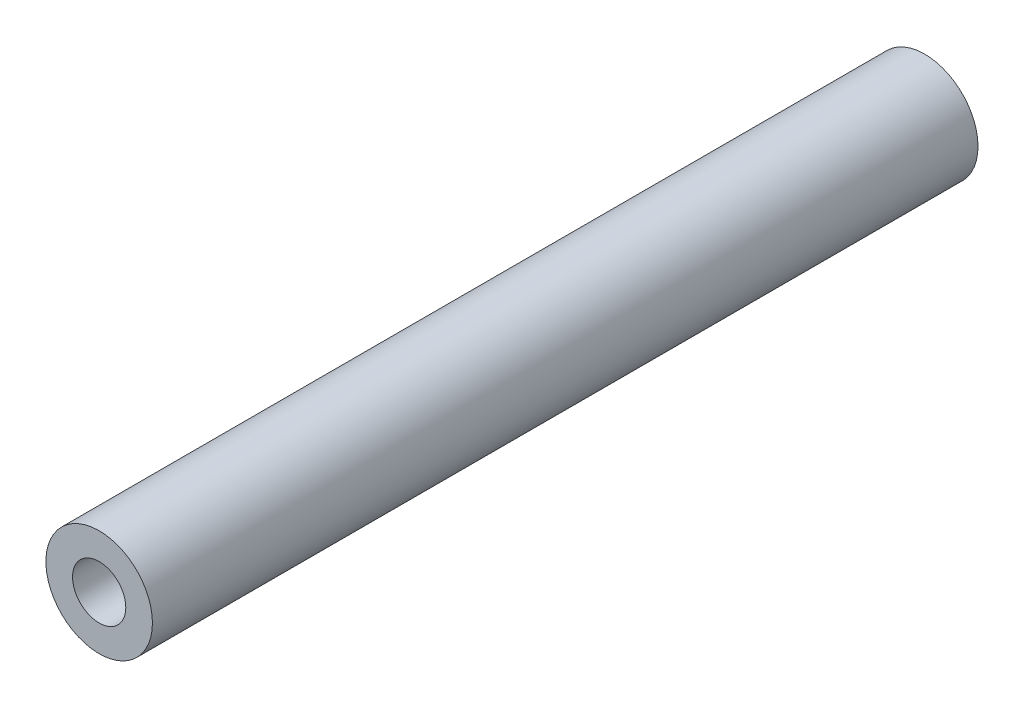
ISO-10303-21;
HEADER;
FILE_DESCRIPTION(('STEP AP214'),'2;1');
FILE_NAME('part.step','',(''),(''),'','','');
FILE_SCHEMA(('AUTOMOTIVE_DESIGN { 1 0 10303 214 1 1 1 1 }'));
ENDSEC;
DATA;
#1=APPLICATION_CONTEXT('core data for automotive mechanical design processes');
#2=APPLICATION_PROTOCOL_DEFINITION('international standard','automotive_design',2000,#1);
#3=PRODUCT_CONTEXT('',#1,'mechanical');
#4=PRODUCT('Part','Part','',(#3));
#5=PRODUCT_RELATED_PRODUCT_CATEGORY('part','',(#4));
#6=PRODUCT_DEFINITION_FORMATION('','',#4);
#7=PRODUCT_DEFINITION_CONTEXT('part definition',#1,'design');
#8=PRODUCT_DEFINITION('design','',#6,#7);
#9=PRODUCT_DEFINITION_SHAPE('','',#8);
#10=(LENGTH_UNIT() NAMED_UNIT(*) SI_UNIT(.MILLI.,.METRE.));
#11=(NAMED_UNIT(*) PLANE_ANGLE_UNIT() SI_UNIT($,.RADIAN.));
#12=(NAMED_UNIT(*) SI_UNIT($,.STERADIAN.) SOLID_ANGLE_UNIT());
#13=UNCERTAINTY_MEASURE_WITH_UNIT(LENGTH_MEASURE(1.E-05),#10,'distance_accuracy_value','');
#14=(GEOMETRIC_REPRESENTATION_CONTEXT(3) GLOBAL_UNCERTAINTY_ASSIGNED_CONTEXT((#13)) GLOBAL_UNIT_ASSIGNED_CONTEXT((#10,
#11,#12)) REPRESENTATION_CONTEXT('',''));
#15=CARTESIAN_POINT('',(0.,0.,0.));
#16=DIRECTION('',(0.,0.,1.));
#17=DIRECTION('',(1.,0.,0.));
#18=AXIS2_PLACEMENT_3D('',#15,#16,#17);
#19=CARTESIAN_POINT('',(0.,0.,98.425));
#20=DIRECTION('',(0.,0.,1.));
#21=DIRECTION('',(1.,0.,0.));
#22=AXIS2_PLACEMENT_3D('',#19,#20,#21);
#23=PLANE('',#22);
#24=CARTESIAN_POINT('',(0.,0.,98.425));
#25=DIRECTION('',(0.,0.,1.));
#26=DIRECTION('',(1.,0.,0.));
#27=AXIS2_PLACEMENT_3D('',#24,#25,#26);
#28=CIRCLE('',#27,6.35);
#29=CARTESIAN_POINT('',(6.35,0.,98.425));
#30=VERTEX_POINT('',#29);
#31=EDGE_CURVE('E10',#30,#30,#28,.T.);
#32=ORIENTED_EDGE('',*,*,#31,.T.);
#33=EDGE_LOOP('',(#32));
#34=FACE_BOUND('',#33,.T.);
#35=CARTESIAN_POINT('',(0.,0.,98.425));
#36=DIRECTION('',(0.,0.,1.));
#37=DIRECTION('',(1.,0.,0.));
#38=AXIS2_PLACEMENT_3D('',#35,#36,#37);
#39=CIRCLE('',#38,3.175);
#40=CARTESIAN_POINT('',(3.175,0.,98.425));
#41=VERTEX_POINT('',#40);
#42=EDGE_CURVE('E42',#41,#41,#39,.T.);
#43=ORIENTED_EDGE('',*,*,#42,.F.);
#44=EDGE_LOOP('',(#43));
#45=FACE_BOUND('',#44,.T.);
#46=ADVANCED_FACE('F31',(#34,#45),#23,.T.);
#47=CARTESIAN_POINT('',(0.,0.,0.));
#48=DIRECTION('',(0.,0.,1.));
#49=DIRECTION('',(1.,0.,0.));
#50=AXIS2_PLACEMENT_3D('',#47,#48,#49);
#51=PLANE('',#50);
#52=CARTESIAN_POINT('',(0.,0.,0.));
#53=DIRECTION('',(0.,0.,1.));
#54=DIRECTION('',(1.,0.,0.));
#55=AXIS2_PLACEMENT_3D('',#52,#53,#54);
#56=CIRCLE('',#55,6.35);
#57=CARTESIAN_POINT('',(6.35,0.,0.));
#58=VERTEX_POINT('',#57);
#59=EDGE_CURVE('E35',#58,#58,#56,.T.);
#60=ORIENTED_EDGE('',*,*,#59,.F.);
#61=EDGE_LOOP('',(#60));
#62=FACE_BOUND('',#61,.T.);
#63=CARTESIAN_POINT('',(0.,0.,0.));
#64=DIRECTION('',(0.,0.,1.));
#65=DIRECTION('',(1.,0.,0.));
#66=AXIS2_PLACEMENT_3D('',#63,#64,#65);
#67=CIRCLE('',#66,3.175);
#68=CARTESIAN_POINT('',(3.175,0.,0.));
#69=VERTEX_POINT('',#68);
#70=EDGE_CURVE('E44',#69,#69,#67,.T.);
#71=ORIENTED_EDGE('',*,*,#70,.T.);
#72=EDGE_LOOP('',(#71));
#73=FACE_BOUND('',#72,.T.);
#74=ADVANCED_FACE('F54',(#62,#73),#51,.F.);
#75=CARTESIAN_POINT('',(0.,0.,98.425));
#76=DIRECTION('',(0.,0.,-1.));
#77=DIRECTION('',(-1.,0.,0.));
#78=AXIS2_PLACEMENT_3D('',#75,#76,#77);
#79=CYLINDRICAL_SURFACE('',#78,6.35);
#80=ORIENTED_EDGE('',*,*,#31,.F.);
#81=EDGE_LOOP('',(#80));
#82=FACE_BOUND('',#81,.T.);
#83=ORIENTED_EDGE('',*,*,#59,.T.);
#84=EDGE_LOOP('',(#83));
#85=FACE_BOUND('',#84,.T.);
#86=ADVANCED_FACE('F33',(#82,#85),#79,.T.);
#87=CARTESIAN_POINT('',(0.,0.,98.425));
#88=DIRECTION('',(0.,0.,-1.));
#89=DIRECTION('',(-1.,0.,0.));
#90=AXIS2_PLACEMENT_3D('',#87,#88,#89);
#91=CYLINDRICAL_SURFACE('',#90,3.175);
#92=ORIENTED_EDGE('',*,*,#42,.T.);
#93=EDGE_LOOP('',(#92));
#94=FACE_BOUND('',#93,.T.);
#95=ORIENTED_EDGE('',*,*,#70,.F.);
#96=EDGE_LOOP('',(#95));
#97=FACE_BOUND('',#96,.T.);
#98=ADVANCED_FACE('F50',(#94,#97),#91,.F.);
#99=CLOSED_SHELL('',(#46,#74,#86,#98));
#100=MANIFOLD_SOLID_BREP('B2',#99);
#101=ADVANCED_BREP_SHAPE_REPRESENTATION('',(#18,#100),#14);
#102=SHAPE_DEFINITION_REPRESENTATION(#9,#101);
ENDSEC;
END-ISO-10303-21;
